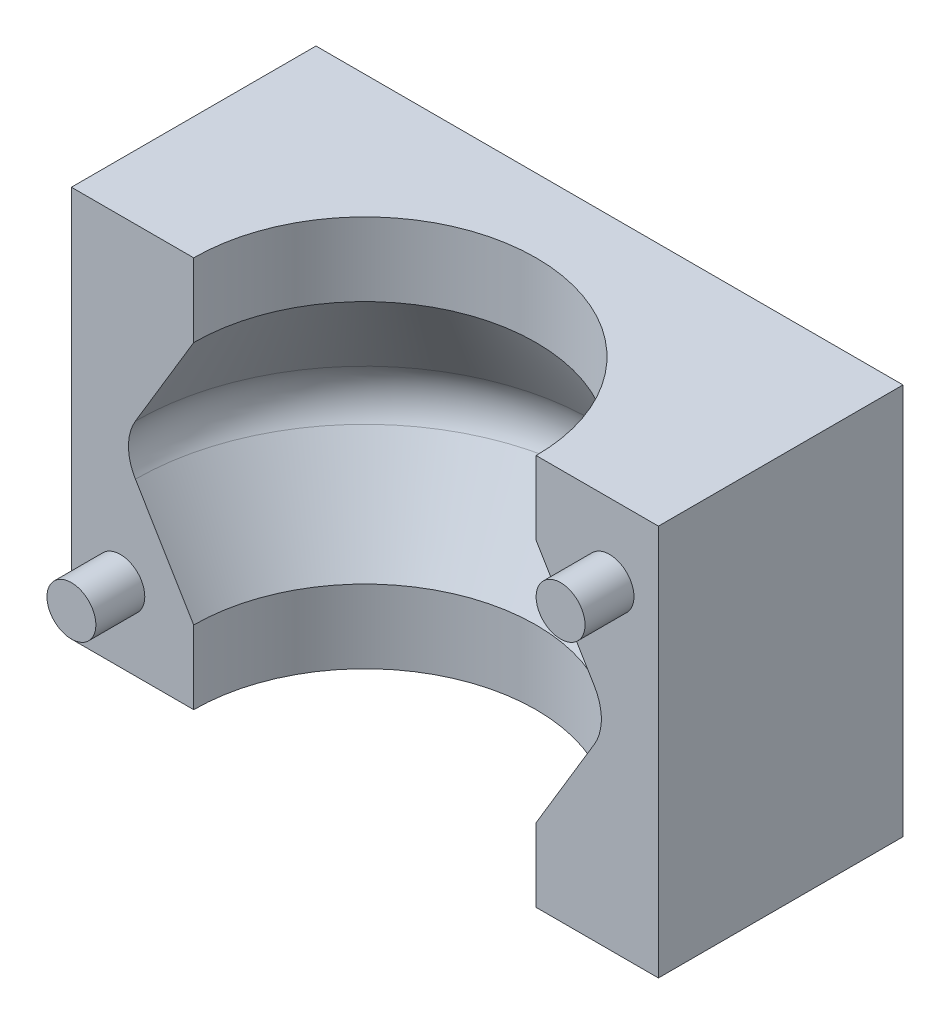
ISO-10303-21;
HEADER;
FILE_DESCRIPTION(('STEP AP214'),'2;1');
FILE_NAME('part.step','',(''),(''),'','','');
FILE_SCHEMA(('AUTOMOTIVE_DESIGN { 1 0 10303 214 1 1 1 1 }'));
ENDSEC;
DATA;
#1=APPLICATION_CONTEXT('core data for automotive mechanical design processes');
#2=APPLICATION_PROTOCOL_DEFINITION('international standard','automotive_design',2000,#1);
#3=PRODUCT_CONTEXT('',#1,'mechanical');
#4=PRODUCT('Part','Part','',(#3));
#5=PRODUCT_RELATED_PRODUCT_CATEGORY('part','',(#4));
#6=PRODUCT_DEFINITION_FORMATION('','',#4);
#7=PRODUCT_DEFINITION_CONTEXT('part definition',#1,'design');
#8=PRODUCT_DEFINITION('design','',#6,#7);
#9=PRODUCT_DEFINITION_SHAPE('','',#8);
#10=(LENGTH_UNIT() NAMED_UNIT(*) SI_UNIT(.MILLI.,.METRE.));
#11=(NAMED_UNIT(*) PLANE_ANGLE_UNIT() SI_UNIT($,.RADIAN.));
#12=(NAMED_UNIT(*) SI_UNIT($,.STERADIAN.) SOLID_ANGLE_UNIT());
#13=UNCERTAINTY_MEASURE_WITH_UNIT(LENGTH_MEASURE(1.E-05),#10,'distance_accuracy_value','');
#14=(GEOMETRIC_REPRESENTATION_CONTEXT(3) GLOBAL_UNCERTAINTY_ASSIGNED_CONTEXT((#13)) GLOBAL_UNIT_ASSIGNED_CONTEXT((#10,
#11,#12)) REPRESENTATION_CONTEXT('',''));
#15=CARTESIAN_POINT('',(0.,0.,0.));
#16=DIRECTION('',(0.,0.,1.));
#17=DIRECTION('',(1.,0.,0.));
#18=AXIS2_PLACEMENT_3D('',#15,#16,#17);
#19=CARTESIAN_POINT('',(0.,0.,50.));
#20=DIRECTION('',(0.,0.,1.));
#21=DIRECTION('',(1.,0.,0.));
#22=AXIS2_PLACEMENT_3D('',#19,#20,#21);
#23=PLANE('',#22);
#24=DIRECTION('',(0.,1.,0.));
#25=VECTOR('',#24,1.);
#26=CARTESIAN_POINT('',(35.,43.9271388886267,50.));
#27=LINE('',#26,#25);
#28=CARTESIAN_POINT('',(35.,25.,50.));
#29=VERTEX_POINT('',#28);
#30=CARTESIAN_POINT('',(35.,40.,50.));
#31=VERTEX_POINT('',#30);
#32=EDGE_CURVE('E11',#29,#31,#27,.T.);
#33=ORIENTED_EDGE('',*,*,#32,.F.);
#34=DIRECTION('',(-0.514495755427526,0.857492925712545,0.));
#35=VECTOR('',#34,1.);
#36=CARTESIAN_POINT('',(0.,83.3333333333334,50.));
#37=LINE('',#36,#35);
#38=CARTESIAN_POINT('',(46.9130254674348,5.14495755427526,50.));
#39=VERTEX_POINT('',#38);
#40=EDGE_CURVE('E50',#39,#29,#37,.T.);
#41=ORIENTED_EDGE('',*,*,#40,.F.);
#42=CARTESIAN_POINT('',(38.3380962103094,0.,50.));
#43=DIRECTION('',(0.,0.,1.));
#44=DIRECTION('',(1.,0.,0.));
#45=AXIS2_PLACEMENT_3D('',#42,#43,#44);
#46=CIRCLE('',#45,9.99999999999999);
#47=CARTESIAN_POINT('',(46.9130254674348,-5.14495755427525,50.));
#48=VERTEX_POINT('',#47);
#49=EDGE_CURVE('E205',#48,#39,#46,.T.);
#50=ORIENTED_EDGE('',*,*,#49,.F.);
#51=DIRECTION('',(0.514495755427526,0.857492925712545,0.));
#52=VECTOR('',#51,1.);
#53=CARTESIAN_POINT('',(0.,-83.3333333333335,50.));
#54=LINE('',#53,#52);
#55=CARTESIAN_POINT('',(35.,-25.,50.));
#56=VERTEX_POINT('',#55);
#57=EDGE_CURVE('E143',#56,#48,#54,.T.);
#58=ORIENTED_EDGE('',*,*,#57,.F.);
#59=DIRECTION('',(0.,1.,0.));
#60=VECTOR('',#59,1.);
#61=CARTESIAN_POINT('',(35.,43.9271388886267,50.));
#62=LINE('',#61,#60);
#63=CARTESIAN_POINT('',(35.,-40.,50.));
#64=VERTEX_POINT('',#63);
#65=EDGE_CURVE('E130',#64,#56,#62,.T.);
#66=ORIENTED_EDGE('',*,*,#65,.F.);
#67=DIRECTION('',(1.,0.,0.));
#68=VECTOR('',#67,1.);
#69=CARTESIAN_POINT('',(60.,-40.,50.));
#70=LINE('',#69,#68);
#71=CARTESIAN_POINT('',(60.,-40.,50.));
#72=VERTEX_POINT('',#71);
#73=EDGE_CURVE('E140',#64,#72,#70,.T.);
#74=ORIENTED_EDGE('',*,*,#73,.T.);
#75=DIRECTION('',(0.,1.,0.));
#76=VECTOR('',#75,1.);
#77=CARTESIAN_POINT('',(60.,-40.,50.));
#78=LINE('',#77,#76);
#79=CARTESIAN_POINT('',(60.,40.,50.));
#80=VERTEX_POINT('',#79);
#81=EDGE_CURVE('E156',#72,#80,#78,.T.);
#82=ORIENTED_EDGE('',*,*,#81,.T.);
#83=DIRECTION('',(-1.,0.,0.));
#84=VECTOR('',#83,1.);
#85=CARTESIAN_POINT('',(60.,40.,50.));
#86=LINE('',#85,#84);
#87=EDGE_CURVE('E162',#80,#31,#86,.T.);
#88=ORIENTED_EDGE('',*,*,#87,.T.);
#89=EDGE_LOOP('',(#33,#41,#50,#58,#66,#74,#82,#88));
#90=FACE_BOUND('',#89,.T.);
#91=CARTESIAN_POINT('',(50.,25.,50.));
#92=DIRECTION('',(0.,0.,1.));
#93=DIRECTION('',(1.,0.,0.));
#94=AXIS2_PLACEMENT_3D('',#91,#92,#93);
#95=CIRCLE('',#94,5.);
#96=CARTESIAN_POINT('',(55.,25.,50.));
#97=VERTEX_POINT('',#96);
#98=EDGE_CURVE('E238',#97,#97,#95,.T.);
#99=ORIENTED_EDGE('',*,*,#98,.F.);
#100=EDGE_LOOP('',(#99));
#101=FACE_BOUND('',#100,.T.);
#102=ADVANCED_FACE('F41',(#90,#101),#23,.T.);
#103=CARTESIAN_POINT('',(-60.,-40.,50.));
#104=DIRECTION('',(1.,0.,0.));
#105=DIRECTION('',(0.,0.,-1.));
#106=AXIS2_PLACEMENT_3D('',#103,#104,#105);
#107=PLANE('',#106);
#108=DIRECTION('',(0.,-1.,0.));
#109=VECTOR('',#108,1.);
#110=CARTESIAN_POINT('',(-60.,-40.,0.));
#111=LINE('',#110,#109);
#112=CARTESIAN_POINT('',(-60.,40.,0.));
#113=VERTEX_POINT('',#112);
#114=CARTESIAN_POINT('',(-60.,-40.,0.));
#115=VERTEX_POINT('',#114);
#116=EDGE_CURVE('E167',#113,#115,#111,.T.);
#117=ORIENTED_EDGE('',*,*,#116,.T.);
#118=DIRECTION('',(0.,0.,-1.));
#119=VECTOR('',#118,1.);
#120=CARTESIAN_POINT('',(-60.,-40.,50.));
#121=LINE('',#120,#119);
#122=CARTESIAN_POINT('',(-60.,-40.,50.));
#123=VERTEX_POINT('',#122);
#124=EDGE_CURVE('E187',#123,#115,#121,.T.);
#125=ORIENTED_EDGE('',*,*,#124,.F.);
#126=DIRECTION('',(0.,-1.,0.));
#127=VECTOR('',#126,1.);
#128=CARTESIAN_POINT('',(-60.,-40.,50.));
#129=LINE('',#128,#127);
#130=CARTESIAN_POINT('',(-60.,40.,50.));
#131=VERTEX_POINT('',#130);
#132=EDGE_CURVE('E152',#131,#123,#129,.T.);
#133=ORIENTED_EDGE('',*,*,#132,.F.);
#134=DIRECTION('',(0.,0.,-1.));
#135=VECTOR('',#134,1.);
#136=CARTESIAN_POINT('',(-60.,40.,50.));
#137=LINE('',#136,#135);
#138=EDGE_CURVE('E166',#131,#113,#137,.T.);
#139=ORIENTED_EDGE('',*,*,#138,.T.);
#140=EDGE_LOOP('',(#117,#125,#133,#139));
#141=FACE_BOUND('',#140,.T.);
#142=ADVANCED_FACE('F43',(#141),#107,.F.);
#143=CARTESIAN_POINT('',(60.,-40.,50.));
#144=DIRECTION('',(0.,1.,0.));
#145=DIRECTION('',(-1.,0.,0.));
#146=AXIS2_PLACEMENT_3D('',#143,#144,#145);
#147=PLANE('',#146);
#148=ORIENTED_EDGE('',*,*,#73,.F.);
#149=CARTESIAN_POINT('',(0.,-40.,50.));
#150=DIRECTION('',(0.,1.,0.));
#151=DIRECTION('',(0.,0.,1.));
#152=AXIS2_PLACEMENT_3D('',#149,#150,#151);
#153=CIRCLE('',#152,35.);
#154=CARTESIAN_POINT('',(-35.,-40.,50.));
#155=VERTEX_POINT('',#154);
#156=EDGE_CURVE('E127',#64,#155,#153,.T.);
#157=ORIENTED_EDGE('',*,*,#156,.T.);
#158=EDGE_CURVE('E96',#123,#155,#70,.T.);
#159=ORIENTED_EDGE('',*,*,#158,.F.);
#160=ORIENTED_EDGE('',*,*,#124,.T.);
#161=DIRECTION('',(1.,0.,0.));
#162=VECTOR('',#161,1.);
#163=CARTESIAN_POINT('',(60.,-40.,0.));
#164=LINE('',#163,#162);
#165=CARTESIAN_POINT('',(60.,-40.,0.));
#166=VERTEX_POINT('',#165);
#167=EDGE_CURVE('E171',#115,#166,#164,.T.);
#168=ORIENTED_EDGE('',*,*,#167,.T.);
#169=DIRECTION('',(0.,0.,-1.));
#170=VECTOR('',#169,1.);
#171=CARTESIAN_POINT('',(60.,-40.,50.));
#172=LINE('',#171,#170);
#173=EDGE_CURVE('E149',#72,#166,#172,.T.);
#174=ORIENTED_EDGE('',*,*,#173,.F.);
#175=EDGE_LOOP('',(#148,#157,#159,#160,#168,#174));
#176=FACE_BOUND('',#175,.T.);
#177=ADVANCED_FACE('F147',(#176),#147,.F.);
#178=CARTESIAN_POINT('',(60.,-40.,50.));
#179=DIRECTION('',(-1.,0.,0.));
#180=DIRECTION('',(0.,0.,1.));
#181=AXIS2_PLACEMENT_3D('',#178,#179,#180);
#182=PLANE('',#181);
#183=DIRECTION('',(0.,1.,0.));
#184=VECTOR('',#183,1.);
#185=CARTESIAN_POINT('',(60.,-40.,0.));
#186=LINE('',#185,#184);
#187=CARTESIAN_POINT('',(60.,40.,0.));
#188=VERTEX_POINT('',#187);
#189=EDGE_CURVE('E175',#166,#188,#186,.T.);
#190=ORIENTED_EDGE('',*,*,#189,.T.);
#191=DIRECTION('',(0.,0.,-1.));
#192=VECTOR('',#191,1.);
#193=CARTESIAN_POINT('',(60.,40.,50.));
#194=LINE('',#193,#192);
#195=EDGE_CURVE('E182',#80,#188,#194,.T.);
#196=ORIENTED_EDGE('',*,*,#195,.F.);
#197=ORIENTED_EDGE('',*,*,#81,.F.);
#198=ORIENTED_EDGE('',*,*,#173,.T.);
#199=EDGE_LOOP('',(#190,#196,#197,#198));
#200=FACE_BOUND('',#199,.T.);
#201=ADVANCED_FACE('F263',(#200),#182,.F.);
#202=CARTESIAN_POINT('',(60.,40.,50.));
#203=DIRECTION('',(0.,-1.,0.));
#204=DIRECTION('',(1.,0.,0.));
#205=AXIS2_PLACEMENT_3D('',#202,#203,#204);
#206=PLANE('',#205);
#207=CARTESIAN_POINT('',(-35.,40.,50.));
#208=VERTEX_POINT('',#207);
#209=EDGE_CURVE('E66',#208,#131,#86,.T.);
#210=ORIENTED_EDGE('',*,*,#209,.F.);
#211=CARTESIAN_POINT('',(0.,40.,50.));
#212=DIRECTION('',(0.,1.,0.));
#213=DIRECTION('',(0.,0.,1.));
#214=AXIS2_PLACEMENT_3D('',#211,#212,#213);
#215=CIRCLE('',#214,35.);
#216=EDGE_CURVE('E222',#31,#208,#215,.T.);
#217=ORIENTED_EDGE('',*,*,#216,.F.);
#218=ORIENTED_EDGE('',*,*,#87,.F.);
#219=ORIENTED_EDGE('',*,*,#195,.T.);
#220=DIRECTION('',(-1.,0.,0.));
#221=VECTOR('',#220,1.);
#222=CARTESIAN_POINT('',(60.,40.,0.));
#223=LINE('',#222,#221);
#224=EDGE_CURVE('E88',#188,#113,#223,.T.);
#225=ORIENTED_EDGE('',*,*,#224,.T.);
#226=ORIENTED_EDGE('',*,*,#138,.F.);
#227=EDGE_LOOP('',(#210,#217,#218,#219,#225,#226));
#228=FACE_BOUND('',#227,.T.);
#229=ADVANCED_FACE('F226',(#228),#206,.F.);
#230=DIRECTION('',(0.,1.,0.));
#231=VECTOR('',#230,1.);
#232=CARTESIAN_POINT('',(-35.,43.9271388886267,50.));
#233=LINE('',#232,#231);
#234=CARTESIAN_POINT('',(-35.,25.,50.));
#235=VERTEX_POINT('',#234);
#236=EDGE_CURVE('E145',#208,#235,#233,.F.);
#237=ORIENTED_EDGE('',*,*,#236,.F.);
#238=ORIENTED_EDGE('',*,*,#209,.T.);
#239=ORIENTED_EDGE('',*,*,#132,.T.);
#240=ORIENTED_EDGE('',*,*,#158,.T.);
#241=DIRECTION('',(0.,1.,0.));
#242=VECTOR('',#241,1.);
#243=CARTESIAN_POINT('',(-35.,43.9271388886267,50.));
#244=LINE('',#243,#242);
#245=CARTESIAN_POINT('',(-35.,-25.,50.));
#246=VERTEX_POINT('',#245);
#247=EDGE_CURVE('E132',#246,#155,#244,.F.);
#248=ORIENTED_EDGE('',*,*,#247,.F.);
#249=DIRECTION('',(0.514495755427526,-0.857492925712545,0.));
#250=VECTOR('',#249,1.);
#251=CARTESIAN_POINT('',(0.,-83.3333333333335,50.));
#252=LINE('',#251,#250);
#253=CARTESIAN_POINT('',(-46.9130254674348,-5.14495755427525,50.));
#254=VERTEX_POINT('',#253);
#255=EDGE_CURVE('E192',#254,#246,#252,.T.);
#256=ORIENTED_EDGE('',*,*,#255,.F.);
#257=CARTESIAN_POINT('',(-38.3380962103094,0.,50.));
#258=DIRECTION('',(0.,0.,1.));
#259=DIRECTION('',(1.,0.,0.));
#260=AXIS2_PLACEMENT_3D('',#257,#258,#259);
#261=CIRCLE('',#260,9.99999999999999);
#262=CARTESIAN_POINT('',(-46.9130254674348,5.14495755427526,50.));
#263=VERTEX_POINT('',#262);
#264=EDGE_CURVE('E195',#263,#254,#261,.T.);
#265=ORIENTED_EDGE('',*,*,#264,.F.);
#266=DIRECTION('',(-0.514495755427526,-0.857492925712545,0.));
#267=VECTOR('',#266,1.);
#268=CARTESIAN_POINT('',(0.,83.3333333333334,50.));
#269=LINE('',#268,#267);
#270=EDGE_CURVE('E198',#235,#263,#269,.T.);
#271=ORIENTED_EDGE('',*,*,#270,.F.);
#272=EDGE_LOOP('',(#237,#238,#239,#240,#248,#256,#265,#271));
#273=FACE_BOUND('',#272,.T.);
#274=CARTESIAN_POINT('',(-50.,-25.,50.));
#275=DIRECTION('',(0.,0.,1.));
#276=DIRECTION('',(1.,0.,0.));
#277=AXIS2_PLACEMENT_3D('',#274,#275,#276);
#278=CIRCLE('',#277,5.);
#279=CARTESIAN_POINT('',(-45.,-25.,50.));
#280=VERTEX_POINT('',#279);
#281=EDGE_CURVE('E228',#280,#280,#278,.T.);
#282=ORIENTED_EDGE('',*,*,#281,.F.);
#283=EDGE_LOOP('',(#282));
#284=FACE_BOUND('',#283,.T.);
#285=ADVANCED_FACE('F249',(#273,#284),#23,.T.);
#286=CARTESIAN_POINT('',(0.,0.,0.));
#287=DIRECTION('',(0.,0.,1.));
#288=DIRECTION('',(1.,0.,0.));
#289=AXIS2_PLACEMENT_3D('',#286,#287,#288);
#290=PLANE('',#289);
#291=ORIENTED_EDGE('',*,*,#116,.F.);
#292=ORIENTED_EDGE('',*,*,#224,.F.);
#293=ORIENTED_EDGE('',*,*,#189,.F.);
#294=ORIENTED_EDGE('',*,*,#167,.F.);
#295=EDGE_LOOP('',(#291,#292,#293,#294));
#296=FACE_BOUND('',#295,.T.);
#297=ADVANCED_FACE('F257',(#296),#290,.F.);
#298=CARTESIAN_POINT('',(50.,25.,60.));
#299=DIRECTION('',(0.,0.,-1.));
#300=DIRECTION('',(-1.,0.,0.));
#301=AXIS2_PLACEMENT_3D('',#298,#299,#300);
#302=CYLINDRICAL_SURFACE('',#301,5.);
#303=CARTESIAN_POINT('',(50.,25.,60.));
#304=DIRECTION('',(0.,0.,1.));
#305=DIRECTION('',(1.,0.,0.));
#306=AXIS2_PLACEMENT_3D('',#303,#304,#305);
#307=CIRCLE('',#306,5.);
#308=CARTESIAN_POINT('',(55.,25.,60.));
#309=VERTEX_POINT('',#308);
#310=EDGE_CURVE('E172',#309,#309,#307,.T.);
#311=ORIENTED_EDGE('',*,*,#310,.F.);
#312=EDGE_LOOP('',(#311));
#313=FACE_BOUND('',#312,.T.);
#314=ORIENTED_EDGE('',*,*,#98,.T.);
#315=EDGE_LOOP('',(#314));
#316=FACE_BOUND('',#315,.T.);
#317=ADVANCED_FACE('F246',(#313,#316),#302,.T.);
#318=CARTESIAN_POINT('',(50.,25.,60.));
#319=DIRECTION('',(0.,0.,1.));
#320=DIRECTION('',(1.,0.,0.));
#321=AXIS2_PLACEMENT_3D('',#318,#319,#320);
#322=PLANE('',#321);
#323=ORIENTED_EDGE('',*,*,#310,.T.);
#324=EDGE_LOOP('',(#323));
#325=FACE_BOUND('',#324,.T.);
#326=ADVANCED_FACE('F271',(#325),#322,.T.);
#327=CARTESIAN_POINT('',(-50.,-25.,60.));
#328=DIRECTION('',(0.,0.,-1.));
#329=DIRECTION('',(-1.,0.,0.));
#330=AXIS2_PLACEMENT_3D('',#327,#328,#329);
#331=CYLINDRICAL_SURFACE('',#330,5.);
#332=CARTESIAN_POINT('',(-50.,-25.,60.));
#333=DIRECTION('',(0.,0.,1.));
#334=DIRECTION('',(1.,0.,0.));
#335=AXIS2_PLACEMENT_3D('',#332,#333,#334);
#336=CIRCLE('',#335,5.);
#337=CARTESIAN_POINT('',(-45.,-25.,60.));
#338=VERTEX_POINT('',#337);
#339=EDGE_CURVE('E232',#338,#338,#336,.T.);
#340=ORIENTED_EDGE('',*,*,#339,.F.);
#341=EDGE_LOOP('',(#340));
#342=FACE_BOUND('',#341,.T.);
#343=ORIENTED_EDGE('',*,*,#281,.T.);
#344=EDGE_LOOP('',(#343));
#345=FACE_BOUND('',#344,.T.);
#346=ADVANCED_FACE('F268',(#342,#345),#331,.T.);
#347=CARTESIAN_POINT('',(-50.,-25.,60.));
#348=DIRECTION('',(0.,0.,1.));
#349=DIRECTION('',(1.,0.,0.));
#350=AXIS2_PLACEMENT_3D('',#347,#348,#349);
#351=PLANE('',#350);
#352=ORIENTED_EDGE('',*,*,#339,.T.);
#353=EDGE_LOOP('',(#352));
#354=FACE_BOUND('',#353,.T.);
#355=ADVANCED_FACE('F270',(#354),#351,.T.);
#356=CARTESIAN_POINT('',(0.,43.9271388886267,50.));
#357=DIRECTION('',(0.,1.,0.));
#358=DIRECTION('',(0.,0.,1.));
#359=AXIS2_PLACEMENT_3D('',#356,#357,#358);
#360=CYLINDRICAL_SURFACE('',#359,35.);
#361=ORIENTED_EDGE('',*,*,#32,.T.);
#362=ORIENTED_EDGE('',*,*,#216,.T.);
#363=ORIENTED_EDGE('',*,*,#236,.T.);
#364=CARTESIAN_POINT('',(0.,25.,50.));
#365=DIRECTION('',(0.,1.,0.));
#366=DIRECTION('',(0.,0.,1.));
#367=AXIS2_PLACEMENT_3D('',#364,#365,#366);
#368=CIRCLE('',#367,35.);
#369=EDGE_CURVE('E214',#29,#235,#368,.T.);
#370=ORIENTED_EDGE('',*,*,#369,.F.);
#371=EDGE_LOOP('',(#361,#362,#363,#370));
#372=FACE_BOUND('',#371,.T.);
#373=ADVANCED_FACE('F219',(#372),#360,.F.);
#374=CARTESIAN_POINT('',(0.,25.,50.));
#375=DIRECTION('',(0.,-1.,0.));
#376=DIRECTION('',(0.,0.,-1.));
#377=AXIS2_PLACEMENT_3D('',#374,#375,#376);
#378=CONICAL_SURFACE('',#377,35.,0.540419500270583);
#379=ORIENTED_EDGE('',*,*,#270,.T.);
#380=CARTESIAN_POINT('',(0.,5.14495755427526,50.));
#381=DIRECTION('',(0.,1.,0.));
#382=DIRECTION('',(0.,0.,1.));
#383=AXIS2_PLACEMENT_3D('',#380,#381,#382);
#384=CIRCLE('',#383,46.9130254674348);
#385=EDGE_CURVE('E217',#39,#263,#384,.T.);
#386=ORIENTED_EDGE('',*,*,#385,.F.);
#387=ORIENTED_EDGE('',*,*,#40,.T.);
#388=ORIENTED_EDGE('',*,*,#369,.T.);
#389=EDGE_LOOP('',(#379,#386,#387,#388));
#390=FACE_BOUND('',#389,.T.);
#391=ADVANCED_FACE('F213',(#390),#378,.F.);
#392=CARTESIAN_POINT('',(0.,0.,50.));
#393=DIRECTION('',(0.,1.,0.));
#394=DIRECTION('',(0.,0.,1.));
#395=AXIS2_PLACEMENT_3D('',#392,#393,#394);
#396=TOROIDAL_SURFACE('',#395,38.3380962103094,9.99999999999999);
#397=ORIENTED_EDGE('',*,*,#49,.T.);
#398=ORIENTED_EDGE('',*,*,#385,.T.);
#399=ORIENTED_EDGE('',*,*,#264,.T.);
#400=CARTESIAN_POINT('',(0.,-5.14495755427525,50.));
#401=DIRECTION('',(0.,1.,0.));
#402=DIRECTION('',(0.,0.,1.));
#403=AXIS2_PLACEMENT_3D('',#400,#401,#402);
#404=CIRCLE('',#403,46.9130254674348);
#405=EDGE_CURVE('E379',#48,#254,#404,.T.);
#406=ORIENTED_EDGE('',*,*,#405,.F.);
#407=EDGE_LOOP('',(#397,#398,#399,#406));
#408=FACE_BOUND('',#407,.T.);
#409=ADVANCED_FACE('F346',(#408),#396,.F.);
#410=CARTESIAN_POINT('',(0.,-5.14495755427525,50.));
#411=DIRECTION('',(0.,1.,0.));
#412=DIRECTION('',(0.,0.,1.));
#413=AXIS2_PLACEMENT_3D('',#410,#411,#412);
#414=CONICAL_SURFACE('',#413,46.9130254674348,0.540419500270583);
#415=ORIENTED_EDGE('',*,*,#57,.T.);
#416=ORIENTED_EDGE('',*,*,#405,.T.);
#417=ORIENTED_EDGE('',*,*,#255,.T.);
#418=CARTESIAN_POINT('',(0.,-25.,50.));
#419=DIRECTION('',(0.,1.,0.));
#420=DIRECTION('',(0.,0.,1.));
#421=AXIS2_PLACEMENT_3D('',#418,#419,#420);
#422=CIRCLE('',#421,35.);
#423=EDGE_CURVE('E57',#56,#246,#422,.T.);
#424=ORIENTED_EDGE('',*,*,#423,.F.);
#425=EDGE_LOOP('',(#415,#416,#417,#424));
#426=FACE_BOUND('',#425,.T.);
#427=ADVANCED_FACE('F355',(#426),#414,.F.);
#428=CARTESIAN_POINT('',(0.,43.9271388886267,50.));
#429=DIRECTION('',(0.,1.,0.));
#430=DIRECTION('',(0.,0.,1.));
#431=AXIS2_PLACEMENT_3D('',#428,#429,#430);
#432=CYLINDRICAL_SURFACE('',#431,35.);
#433=ORIENTED_EDGE('',*,*,#65,.T.);
#434=ORIENTED_EDGE('',*,*,#423,.T.);
#435=ORIENTED_EDGE('',*,*,#247,.T.);
#436=ORIENTED_EDGE('',*,*,#156,.F.);
#437=EDGE_LOOP('',(#433,#434,#435,#436));
#438=FACE_BOUND('',#437,.T.);
#439=ADVANCED_FACE('F129',(#438),#432,.F.);
#440=CLOSED_SHELL('',(#102,#142,#177,#201,#229,#285,#297,#317,#326,#346,#355,#373,#391,#409,
#427,#439));
#441=MANIFOLD_SOLID_BREP('B2',#440);
#442=ADVANCED_BREP_SHAPE_REPRESENTATION('',(#18,#441),#14);
#443=SHAPE_DEFINITION_REPRESENTATION(#9,#442);
ENDSEC;
END-ISO-10303-21;
